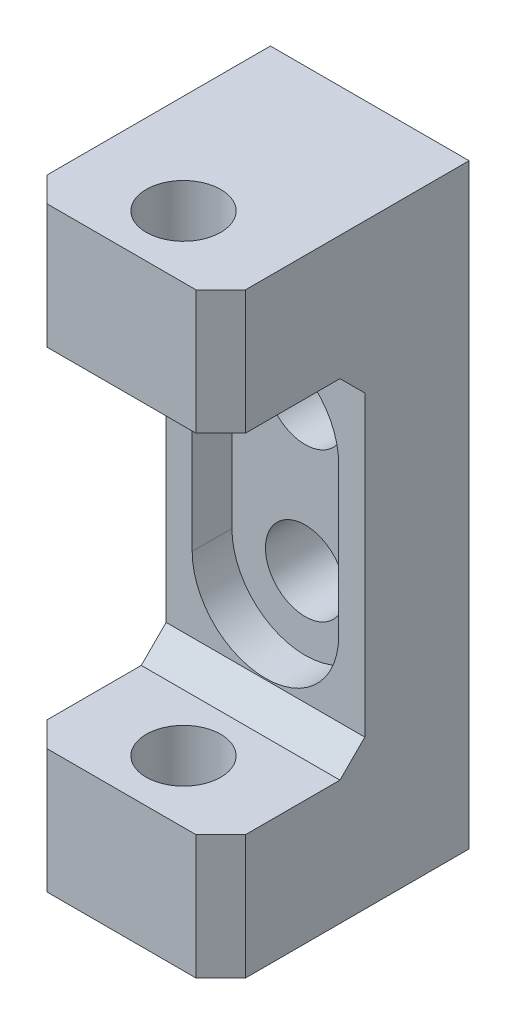
ISO-10303-21;
HEADER;
FILE_DESCRIPTION(('STEP AP214'),'2;1');
FILE_NAME('part.step','',(''),(''),'','','');
FILE_SCHEMA(('AUTOMOTIVE_DESIGN { 1 0 10303 214 1 1 1 1 }'));
ENDSEC;
DATA;
#1=APPLICATION_CONTEXT('core data for automotive mechanical design processes');
#2=APPLICATION_PROTOCOL_DEFINITION('international standard','automotive_design',2000,#1);
#3=PRODUCT_CONTEXT('',#1,'mechanical');
#4=PRODUCT('Part','Part','',(#3));
#5=PRODUCT_RELATED_PRODUCT_CATEGORY('part','',(#4));
#6=PRODUCT_DEFINITION_FORMATION('','',#4);
#7=PRODUCT_DEFINITION_CONTEXT('part definition',#1,'design');
#8=PRODUCT_DEFINITION('design','',#6,#7);
#9=PRODUCT_DEFINITION_SHAPE('','',#8);
#10=(LENGTH_UNIT() NAMED_UNIT(*) SI_UNIT(.MILLI.,.METRE.));
#11=(NAMED_UNIT(*) PLANE_ANGLE_UNIT() SI_UNIT($,.RADIAN.));
#12=(NAMED_UNIT(*) SI_UNIT($,.STERADIAN.) SOLID_ANGLE_UNIT());
#13=UNCERTAINTY_MEASURE_WITH_UNIT(LENGTH_MEASURE(1.E-05),#10,'distance_accuracy_value','');
#14=(GEOMETRIC_REPRESENTATION_CONTEXT(3) GLOBAL_UNCERTAINTY_ASSIGNED_CONTEXT((#13)) GLOBAL_UNIT_ASSIGNED_CONTEXT((#10,
#11,#12)) REPRESENTATION_CONTEXT('',''));
#15=CARTESIAN_POINT('',(0.,0.,0.));
#16=DIRECTION('',(0.,0.,1.));
#17=DIRECTION('',(1.,0.,0.));
#18=AXIS2_PLACEMENT_3D('',#15,#16,#17);
#19=CARTESIAN_POINT('',(104.,80.9999999999999,10.));
#20=DIRECTION('',(0.,1.,0.));
#21=DIRECTION('',(0.,0.,1.));
#22=AXIS2_PLACEMENT_3D('',#19,#20,#21);
#23=PLANE('',#22);
#24=DIRECTION('',(1.,0.,0.));
#25=VECTOR('',#24,1.);
#26=CARTESIAN_POINT('',(104.,80.9999999999999,10.));
#27=LINE('',#26,#25);
#28=CARTESIAN_POINT('',(97.,80.9999999999999,10.));
#29=VERTEX_POINT('',#28);
#30=CARTESIAN_POINT('',(103.,80.9999999999999,10.));
#31=VERTEX_POINT('',#30);
#32=EDGE_CURVE('E221',#29,#31,#27,.T.);
#33=ORIENTED_EDGE('',*,*,#32,.F.);
#34=DIRECTION('',(0.707106781186551,0.,0.707106781186544));
#35=VECTOR('',#34,1.);
#36=CARTESIAN_POINT('',(97.,80.9999999999999,9.99999999999998));
#37=LINE('',#36,#35);
#38=CARTESIAN_POINT('',(96.,80.9999999999999,9.));
#39=VERTEX_POINT('',#38);
#40=EDGE_CURVE('E282',#29,#39,#37,.F.);
#41=ORIENTED_EDGE('',*,*,#40,.T.);
#42=DIRECTION('',(0.,0.,-1.));
#43=VECTOR('',#42,1.);
#44=CARTESIAN_POINT('',(96.,80.9999999999999,10.));
#45=LINE('',#44,#43);
#46=CARTESIAN_POINT('',(96.,80.9999999999999,0.));
#47=VERTEX_POINT('',#46);
#48=EDGE_CURVE('E237',#39,#47,#45,.T.);
#49=ORIENTED_EDGE('',*,*,#48,.T.);
#50=DIRECTION('',(1.,0.,0.));
#51=VECTOR('',#50,1.);
#52=CARTESIAN_POINT('',(104.,80.9999999999999,0.));
#53=LINE('',#52,#51);
#54=CARTESIAN_POINT('',(104.,80.9999999999999,0.));
#55=VERTEX_POINT('',#54);
#56=EDGE_CURVE('E222',#47,#55,#53,.T.);
#57=ORIENTED_EDGE('',*,*,#56,.T.);
#58=DIRECTION('',(0.,0.,-1.));
#59=VECTOR('',#58,1.);
#60=CARTESIAN_POINT('',(104.,80.9999999999999,10.));
#61=LINE('',#60,#59);
#62=CARTESIAN_POINT('',(104.,80.9999999999999,9.));
#63=VERTEX_POINT('',#62);
#64=EDGE_CURVE('E225',#63,#55,#61,.T.);
#65=ORIENTED_EDGE('',*,*,#64,.F.);
#66=DIRECTION('',(0.707106781186551,0.,-0.707106781186544));
#67=VECTOR('',#66,1.);
#68=CARTESIAN_POINT('',(103.,80.9999999999999,9.99999999999998));
#69=LINE('',#68,#67);
#70=EDGE_CURVE('E280',#63,#31,#69,.F.);
#71=ORIENTED_EDGE('',*,*,#70,.T.);
#72=EDGE_LOOP('',(#33,#41,#49,#57,#65,#71));
#73=FACE_BOUND('',#72,.T.);
#74=CARTESIAN_POINT('',(100.,80.9999999999999,7.49999999999998));
#75=DIRECTION('',(0.,1.,0.));
#76=DIRECTION('',(0.,0.,1.));
#77=AXIS2_PLACEMENT_3D('',#74,#75,#76);
#78=CIRCLE('',#77,1.49999999999999);
#79=CARTESIAN_POINT('',(100.,80.9999999999999,8.99999999999997));
#80=VERTEX_POINT('',#79);
#81=EDGE_CURVE('E274',#80,#80,#78,.F.);
#82=ORIENTED_EDGE('',*,*,#81,.F.);
#83=EDGE_LOOP('',(#82));
#84=FACE_BOUND('',#83,.T.);
#85=ADVANCED_FACE('F37',(#73,#84),#23,.F.);
#86=CARTESIAN_POINT('',(100.,95.9999999999998,4.2));
#87=DIRECTION('',(0.,0.,1.));
#88=DIRECTION('',(1.,0.,0.));
#89=AXIS2_PLACEMENT_3D('',#86,#87,#88);
#90=CYLINDRICAL_SURFACE('',#89,2.94999999999999);
#91=DIRECTION('',(0.,0.,1.));
#92=VECTOR('',#91,1.);
#93=CARTESIAN_POINT('',(102.95,95.9999999999999,-10.6823190746194));
#94=LINE('',#93,#92);
#95=CARTESIAN_POINT('',(102.95,95.9999999999999,2.6));
#96=VERTEX_POINT('',#95);
#97=CARTESIAN_POINT('',(102.95,95.9999999999999,4.2));
#98=VERTEX_POINT('',#97);
#99=EDGE_CURVE('E164',#96,#98,#94,.T.);
#100=ORIENTED_EDGE('',*,*,#99,.T.);
#101=CARTESIAN_POINT('',(100.,95.9999999999998,4.2));
#102=DIRECTION('',(0.,0.,1.));
#103=DIRECTION('',(1.,0.,0.));
#104=AXIS2_PLACEMENT_3D('',#101,#102,#103);
#105=CIRCLE('',#104,2.94999999999999);
#106=CARTESIAN_POINT('',(97.0500000000001,95.9999999999999,4.2));
#107=VERTEX_POINT('',#106);
#108=EDGE_CURVE('E191',#98,#107,#105,.T.);
#109=ORIENTED_EDGE('',*,*,#108,.T.);
#110=DIRECTION('',(0.,0.,1.));
#111=VECTOR('',#110,1.);
#112=CARTESIAN_POINT('',(97.0500000000001,95.9999999999999,-10.6823190746194));
#113=LINE('',#112,#111);
#114=CARTESIAN_POINT('',(97.05,95.9999999999999,2.6));
#115=VERTEX_POINT('',#114);
#116=EDGE_CURVE('E175',#115,#107,#113,.T.);
#117=ORIENTED_EDGE('',*,*,#116,.F.);
#118=CARTESIAN_POINT('',(100.,95.9999999999998,2.6));
#119=DIRECTION('',(0.,0.,1.));
#120=DIRECTION('',(1.,0.,0.));
#121=AXIS2_PLACEMENT_3D('',#118,#119,#120);
#122=CIRCLE('',#121,2.94999999999999);
#123=EDGE_CURVE('E183',#96,#115,#122,.T.);
#124=ORIENTED_EDGE('',*,*,#123,.F.);
#125=EDGE_LOOP('',(#100,#109,#117,#124));
#126=FACE_BOUND('',#125,.T.);
#127=ADVANCED_FACE('F189',(#126),#90,.F.);
#128=CARTESIAN_POINT('',(0.,0.,10.));
#129=DIRECTION('',(0.,0.,-1.));
#130=DIRECTION('',(-1.,0.,0.));
#131=AXIS2_PLACEMENT_3D('',#128,#129,#130);
#132=PLANE('',#131);
#133=DIRECTION('',(-1.,0.,0.));
#134=VECTOR('',#133,1.);
#135=CARTESIAN_POINT('',(0.,85.9999999999999,10.));
#136=LINE('',#135,#134);
#137=CARTESIAN_POINT('',(103.,85.9999999999999,10.));
#138=VERTEX_POINT('',#137);
#139=CARTESIAN_POINT('',(97.,85.9999999999999,10.));
#140=VERTEX_POINT('',#139);
#141=EDGE_CURVE('E246',#138,#140,#136,.T.);
#142=ORIENTED_EDGE('',*,*,#141,.T.);
#143=DIRECTION('',(0.,-1.,0.));
#144=VECTOR('',#143,1.);
#145=CARTESIAN_POINT('',(96.9999999999999,0.,10.));
#146=LINE('',#145,#144);
#147=EDGE_CURVE('E277',#140,#29,#146,.T.);
#148=ORIENTED_EDGE('',*,*,#147,.T.);
#149=ORIENTED_EDGE('',*,*,#32,.T.);
#150=DIRECTION('',(0.,1.,0.));
#151=VECTOR('',#150,1.);
#152=CARTESIAN_POINT('',(103.,0.,10.));
#153=LINE('',#152,#151);
#154=EDGE_CURVE('E269',#31,#138,#153,.T.);
#155=ORIENTED_EDGE('',*,*,#154,.T.);
#156=EDGE_LOOP('',(#142,#148,#149,#155));
#157=FACE_BOUND('',#156,.T.);
#158=ADVANCED_FACE('F354',(#157),#132,.F.);
#159=CARTESIAN_POINT('',(104.,105.,10.));
#160=DIRECTION('',(-1.,0.,0.));
#161=DIRECTION('',(0.,-1.,0.));
#162=AXIS2_PLACEMENT_3D('',#159,#160,#161);
#163=PLANE('',#162);
#164=DIRECTION('',(0.,0.,1.));
#165=VECTOR('',#164,1.);
#166=CARTESIAN_POINT('',(104.,85.9999999999999,10.));
#167=LINE('',#166,#165);
#168=CARTESIAN_POINT('',(104.,85.9999999999999,5.20000000000001));
#169=VERTEX_POINT('',#168);
#170=CARTESIAN_POINT('',(104.,85.9999999999999,9.));
#171=VERTEX_POINT('',#170);
#172=EDGE_CURVE('E212',#169,#171,#167,.T.);
#173=ORIENTED_EDGE('',*,*,#172,.T.);
#174=DIRECTION('',(0.,-1.,0.));
#175=VECTOR('',#174,1.);
#176=CARTESIAN_POINT('',(104.,105.,9.));
#177=LINE('',#176,#175);
#178=EDGE_CURVE('E294',#171,#63,#177,.T.);
#179=ORIENTED_EDGE('',*,*,#178,.T.);
#180=ORIENTED_EDGE('',*,*,#64,.T.);
#181=DIRECTION('',(0.,1.,0.));
#182=VECTOR('',#181,1.);
#183=CARTESIAN_POINT('',(104.,105.,0.));
#184=LINE('',#183,#182);
#185=CARTESIAN_POINT('',(104.,105.,0.));
#186=VERTEX_POINT('',#185);
#187=EDGE_CURVE('E218',#55,#186,#184,.T.);
#188=ORIENTED_EDGE('',*,*,#187,.T.);
#189=DIRECTION('',(0.,0.,-1.));
#190=VECTOR('',#189,1.);
#191=CARTESIAN_POINT('',(104.,105.,10.));
#192=LINE('',#191,#190);
#193=CARTESIAN_POINT('',(104.,105.,9.));
#194=VERTEX_POINT('',#193);
#195=EDGE_CURVE('E241',#194,#186,#192,.T.);
#196=ORIENTED_EDGE('',*,*,#195,.F.);
#197=DIRECTION('',(0.,-1.,0.));
#198=VECTOR('',#197,1.);
#199=CARTESIAN_POINT('',(104.,105.,9.));
#200=LINE('',#199,#198);
#201=CARTESIAN_POINT('',(104.,99.9999999999999,9.));
#202=VERTEX_POINT('',#201);
#203=EDGE_CURVE('E292',#194,#202,#200,.T.);
#204=ORIENTED_EDGE('',*,*,#203,.T.);
#205=DIRECTION('',(0.,0.,-1.));
#206=VECTOR('',#205,1.);
#207=CARTESIAN_POINT('',(104.,99.9999999999999,10.));
#208=LINE('',#207,#206);
#209=CARTESIAN_POINT('',(104.,99.9999999999999,5.19999999999999));
#210=VERTEX_POINT('',#209);
#211=EDGE_CURVE('E210',#202,#210,#208,.T.);
#212=ORIENTED_EDGE('',*,*,#211,.T.);
#213=DIRECTION('',(0.,0.707106781186551,0.707106781186544));
#214=VECTOR('',#213,1.);
#215=CARTESIAN_POINT('',(104.,104.9,10.1));
#216=LINE('',#215,#214);
#217=CARTESIAN_POINT('',(104.,98.9999999999999,4.2));
#218=VERTEX_POINT('',#217);
#219=EDGE_CURVE('E267',#210,#218,#216,.F.);
#220=ORIENTED_EDGE('',*,*,#219,.T.);
#221=DIRECTION('',(0.,-1.,0.));
#222=VECTOR('',#221,1.);
#223=CARTESIAN_POINT('',(104.,105.,4.2));
#224=LINE('',#223,#222);
#225=CARTESIAN_POINT('',(104.,86.9999999999999,4.2));
#226=VERTEX_POINT('',#225);
#227=EDGE_CURVE('E215',#218,#226,#224,.T.);
#228=ORIENTED_EDGE('',*,*,#227,.T.);
#229=DIRECTION('',(0.,0.707106781186545,-0.70710678118655));
#230=VECTOR('',#229,1.);
#231=CARTESIAN_POINT('',(104.,93.0999999999998,-1.89999999999998));
#232=LINE('',#231,#230);
#233=EDGE_CURVE('E262',#226,#169,#232,.F.);
#234=ORIENTED_EDGE('',*,*,#233,.T.);
#235=EDGE_LOOP('',(#173,#179,#180,#188,#196,#204,#212,#220,#228,#234));
#236=FACE_BOUND('',#235,.T.);
#237=ADVANCED_FACE('F321',(#236),#163,.F.);
#238=CARTESIAN_POINT('',(104.,105.,10.));
#239=DIRECTION('',(0.,-1.,0.));
#240=DIRECTION('',(0.,0.,-1.));
#241=AXIS2_PLACEMENT_3D('',#238,#239,#240);
#242=PLANE('',#241);
#243=CARTESIAN_POINT('',(100.,105.,7.49999999999998));
#244=DIRECTION('',(0.,1.,0.));
#245=DIRECTION('',(0.,0.,1.));
#246=AXIS2_PLACEMENT_3D('',#243,#244,#245);
#247=CIRCLE('',#246,1.49999999999999);
#248=CARTESIAN_POINT('',(100.,105.,8.99999999999997));
#249=VERTEX_POINT('',#248);
#250=EDGE_CURVE('E490',#249,#249,#247,.T.);
#251=ORIENTED_EDGE('',*,*,#250,.F.);
#252=EDGE_LOOP('',(#251));
#253=FACE_BOUND('',#252,.T.);
#254=DIRECTION('',(-1.,0.,0.));
#255=VECTOR('',#254,1.);
#256=CARTESIAN_POINT('',(104.,105.,10.));
#257=LINE('',#256,#255);
#258=CARTESIAN_POINT('',(103.,105.,10.));
#259=VERTEX_POINT('',#258);
#260=CARTESIAN_POINT('',(97.,105.,10.));
#261=VERTEX_POINT('',#260);
#262=EDGE_CURVE('E219',#259,#261,#257,.T.);
#263=ORIENTED_EDGE('',*,*,#262,.F.);
#264=DIRECTION('',(-0.707106781186551,0.,0.707106781186544));
#265=VECTOR('',#264,1.);
#266=CARTESIAN_POINT('',(103.,105.,9.99999999999997));
#267=LINE('',#266,#265);
#268=EDGE_CURVE('E61',#259,#194,#267,.F.);
#269=ORIENTED_EDGE('',*,*,#268,.T.);
#270=ORIENTED_EDGE('',*,*,#195,.T.);
#271=DIRECTION('',(-1.,0.,0.));
#272=VECTOR('',#271,1.);
#273=CARTESIAN_POINT('',(104.,105.,0.));
#274=LINE('',#273,#272);
#275=CARTESIAN_POINT('',(96.,105.,0.));
#276=VERTEX_POINT('',#275);
#277=EDGE_CURVE('E228',#186,#276,#274,.T.);
#278=ORIENTED_EDGE('',*,*,#277,.T.);
#279=DIRECTION('',(0.,0.,-1.));
#280=VECTOR('',#279,1.);
#281=CARTESIAN_POINT('',(96.,105.,10.));
#282=LINE('',#281,#280);
#283=CARTESIAN_POINT('',(96.,105.,9.));
#284=VERTEX_POINT('',#283);
#285=EDGE_CURVE('E239',#284,#276,#282,.T.);
#286=ORIENTED_EDGE('',*,*,#285,.F.);
#287=DIRECTION('',(-0.707106781186551,0.,-0.707106781186544));
#288=VECTOR('',#287,1.);
#289=CARTESIAN_POINT('',(97.,105.,9.99999999999997));
#290=LINE('',#289,#288);
#291=EDGE_CURVE('E53',#284,#261,#290,.F.);
#292=ORIENTED_EDGE('',*,*,#291,.T.);
#293=EDGE_LOOP('',(#263,#269,#270,#278,#286,#292));
#294=FACE_BOUND('',#293,.T.);
#295=ADVANCED_FACE('F317',(#253,#294),#242,.F.);
#296=CARTESIAN_POINT('',(96.,105.,10.));
#297=DIRECTION('',(1.,0.,0.));
#298=DIRECTION('',(0.,1.,0.));
#299=AXIS2_PLACEMENT_3D('',#296,#297,#298);
#300=PLANE('',#299);
#301=ORIENTED_EDGE('',*,*,#48,.F.);
#302=DIRECTION('',(0.,1.,0.));
#303=VECTOR('',#302,1.);
#304=CARTESIAN_POINT('',(96.,105.,9.));
#305=LINE('',#304,#303);
#306=CARTESIAN_POINT('',(96.,85.9999999999999,9.));
#307=VERTEX_POINT('',#306);
#308=EDGE_CURVE('E286',#39,#307,#305,.T.);
#309=ORIENTED_EDGE('',*,*,#308,.T.);
#310=DIRECTION('',(0.,0.,1.));
#311=VECTOR('',#310,1.);
#312=CARTESIAN_POINT('',(96.,85.9999999999999,4.2));
#313=LINE('',#312,#311);
#314=CARTESIAN_POINT('',(96.,85.9999999999999,5.20000000000001));
#315=VERTEX_POINT('',#314);
#316=EDGE_CURVE('E207',#315,#307,#313,.T.);
#317=ORIENTED_EDGE('',*,*,#316,.F.);
#318=DIRECTION('',(0.,-0.707106781186545,0.70710678118655));
#319=VECTOR('',#318,1.);
#320=CARTESIAN_POINT('',(96.,93.0999999999998,-1.89999999999998));
#321=LINE('',#320,#319);
#322=CARTESIAN_POINT('',(96.,86.9999999999999,4.2));
#323=VERTEX_POINT('',#322);
#324=EDGE_CURVE('E260',#315,#323,#321,.F.);
#325=ORIENTED_EDGE('',*,*,#324,.T.);
#326=DIRECTION('',(0.,-1.,0.));
#327=VECTOR('',#326,1.);
#328=CARTESIAN_POINT('',(96.,99.9999999999999,4.2));
#329=LINE('',#328,#327);
#330=CARTESIAN_POINT('',(96.,98.9999999999999,4.2));
#331=VERTEX_POINT('',#330);
#332=EDGE_CURVE('E204',#331,#323,#329,.T.);
#333=ORIENTED_EDGE('',*,*,#332,.F.);
#334=DIRECTION('',(0.,-0.707106781186551,-0.707106781186544));
#335=VECTOR('',#334,1.);
#336=CARTESIAN_POINT('',(96.,104.9,10.1));
#337=LINE('',#336,#335);
#338=CARTESIAN_POINT('',(96.,99.9999999999999,5.19999999999999));
#339=VERTEX_POINT('',#338);
#340=EDGE_CURVE('E264',#331,#339,#337,.F.);
#341=ORIENTED_EDGE('',*,*,#340,.T.);
#342=DIRECTION('',(0.,0.,-1.));
#343=VECTOR('',#342,1.);
#344=CARTESIAN_POINT('',(96.,99.9999999999999,4.2));
#345=LINE('',#344,#343);
#346=CARTESIAN_POINT('',(96.,99.9999999999999,9.));
#347=VERTEX_POINT('',#346);
#348=EDGE_CURVE('E202',#347,#339,#345,.T.);
#349=ORIENTED_EDGE('',*,*,#348,.F.);
#350=DIRECTION('',(0.,1.,0.));
#351=VECTOR('',#350,1.);
#352=CARTESIAN_POINT('',(96.,105.,9.));
#353=LINE('',#352,#351);
#354=EDGE_CURVE('E284',#347,#284,#353,.T.);
#355=ORIENTED_EDGE('',*,*,#354,.T.);
#356=ORIENTED_EDGE('',*,*,#285,.T.);
#357=DIRECTION('',(0.,-1.,0.));
#358=VECTOR('',#357,1.);
#359=CARTESIAN_POINT('',(96.,105.,0.));
#360=LINE('',#359,#358);
#361=EDGE_CURVE('E231',#276,#47,#360,.T.);
#362=ORIENTED_EDGE('',*,*,#361,.T.);
#363=EDGE_LOOP('',(#301,#309,#317,#325,#333,#341,#349,#355,#356,#362));
#364=FACE_BOUND('',#363,.T.);
#365=ADVANCED_FACE('F312',(#364),#300,.F.);
#366=DIRECTION('',(1.,0.,0.));
#367=VECTOR('',#366,1.);
#368=CARTESIAN_POINT('',(0.,99.9999999999999,10.));
#369=LINE('',#368,#367);
#370=CARTESIAN_POINT('',(97.,99.9999999999999,10.));
#371=VERTEX_POINT('',#370);
#372=CARTESIAN_POINT('',(103.,99.9999999999999,10.));
#373=VERTEX_POINT('',#372);
#374=EDGE_CURVE('E243',#371,#373,#369,.T.);
#375=ORIENTED_EDGE('',*,*,#374,.T.);
#376=DIRECTION('',(0.,1.,0.));
#377=VECTOR('',#376,1.);
#378=CARTESIAN_POINT('',(103.,0.,10.));
#379=LINE('',#378,#377);
#380=EDGE_CURVE('E299',#373,#259,#379,.T.);
#381=ORIENTED_EDGE('',*,*,#380,.T.);
#382=ORIENTED_EDGE('',*,*,#262,.T.);
#383=DIRECTION('',(0.,-1.,0.));
#384=VECTOR('',#383,1.);
#385=CARTESIAN_POINT('',(96.9999999999999,0.,10.));
#386=LINE('',#385,#384);
#387=EDGE_CURVE('E296',#261,#371,#386,.T.);
#388=ORIENTED_EDGE('',*,*,#387,.T.);
#389=EDGE_LOOP('',(#375,#381,#382,#388));
#390=FACE_BOUND('',#389,.T.);
#391=ADVANCED_FACE('F316',(#390),#132,.F.);
#392=CARTESIAN_POINT('',(0.,0.,0.));
#393=DIRECTION('',(0.,0.,-1.));
#394=DIRECTION('',(-1.,0.,0.));
#395=AXIS2_PLACEMENT_3D('',#392,#393,#394);
#396=PLANE('',#395);
#397=CARTESIAN_POINT('',(100.,89.9999999999998,0.));
#398=DIRECTION('',(0.,0.,1.));
#399=DIRECTION('',(1.,0.,0.));
#400=AXIS2_PLACEMENT_3D('',#397,#398,#399);
#401=CIRCLE('',#400,1.6);
#402=CARTESIAN_POINT('',(101.6,89.9999999999998,0.));
#403=VERTEX_POINT('',#402);
#404=EDGE_CURVE('E196',#403,#403,#401,.T.);
#405=ORIENTED_EDGE('',*,*,#404,.T.);
#406=EDGE_LOOP('',(#405));
#407=FACE_BOUND('',#406,.T.);
#408=CARTESIAN_POINT('',(100.,95.9999999999998,0.));
#409=DIRECTION('',(0.,0.,1.));
#410=DIRECTION('',(1.,0.,0.));
#411=AXIS2_PLACEMENT_3D('',#408,#409,#410);
#412=CIRCLE('',#411,1.6);
#413=CARTESIAN_POINT('',(101.6,95.9999999999998,0.));
#414=VERTEX_POINT('',#413);
#415=EDGE_CURVE('E194',#414,#414,#412,.T.);
#416=ORIENTED_EDGE('',*,*,#415,.T.);
#417=EDGE_LOOP('',(#416));
#418=FACE_BOUND('',#417,.T.);
#419=ORIENTED_EDGE('',*,*,#187,.F.);
#420=ORIENTED_EDGE('',*,*,#56,.F.);
#421=ORIENTED_EDGE('',*,*,#361,.F.);
#422=ORIENTED_EDGE('',*,*,#277,.F.);
#423=EDGE_LOOP('',(#419,#420,#421,#422));
#424=FACE_BOUND('',#423,.T.);
#425=ADVANCED_FACE('F360',(#407,#418,#424),#396,.T.);
#426=CARTESIAN_POINT('',(136.,99.9999999999998,4.2));
#427=DIRECTION('',(0.,0.,-1.));
#428=DIRECTION('',(-1.,0.,0.));
#429=AXIS2_PLACEMENT_3D('',#426,#427,#428);
#430=PLANE('',#429);
#431=ORIENTED_EDGE('',*,*,#108,.F.);
#432=DIRECTION('',(0.,1.,0.));
#433=VECTOR('',#432,1.);
#434=CARTESIAN_POINT('',(102.95,89.9999999999998,4.2));
#435=LINE('',#434,#433);
#436=CARTESIAN_POINT('',(102.95,89.9999999999998,4.2));
#437=VERTEX_POINT('',#436);
#438=EDGE_CURVE('E170',#437,#98,#435,.T.);
#439=ORIENTED_EDGE('',*,*,#438,.F.);
#440=CARTESIAN_POINT('',(100.,89.9999999999998,4.2));
#441=DIRECTION('',(0.,0.,1.));
#442=DIRECTION('',(1.,0.,0.));
#443=AXIS2_PLACEMENT_3D('',#440,#441,#442);
#444=CIRCLE('',#443,2.94999999999999);
#445=CARTESIAN_POINT('',(97.0500000000001,89.9999999999998,4.2));
#446=VERTEX_POINT('',#445);
#447=EDGE_CURVE('E469',#446,#437,#444,.T.);
#448=ORIENTED_EDGE('',*,*,#447,.F.);
#449=DIRECTION('',(0.,-1.,0.));
#450=VECTOR('',#449,1.);
#451=CARTESIAN_POINT('',(97.0500000000001,89.9999999999998,4.2));
#452=LINE('',#451,#450);
#453=EDGE_CURVE('E186',#107,#446,#452,.T.);
#454=ORIENTED_EDGE('',*,*,#453,.F.);
#455=EDGE_LOOP('',(#431,#439,#448,#454));
#456=FACE_BOUND('',#455,.T.);
#457=ORIENTED_EDGE('',*,*,#332,.T.);
#458=DIRECTION('',(1.,0.,0.));
#459=VECTOR('',#458,1.);
#460=CARTESIAN_POINT('',(104.,86.9999999999999,4.2));
#461=LINE('',#460,#459);
#462=EDGE_CURVE('E255',#323,#226,#461,.T.);
#463=ORIENTED_EDGE('',*,*,#462,.T.);
#464=ORIENTED_EDGE('',*,*,#227,.F.);
#465=DIRECTION('',(-1.,0.,0.));
#466=VECTOR('',#465,1.);
#467=CARTESIAN_POINT('',(96.,98.9999999999999,4.2));
#468=LINE('',#467,#466);
#469=EDGE_CURVE('E252',#218,#331,#468,.T.);
#470=ORIENTED_EDGE('',*,*,#469,.T.);
#471=EDGE_LOOP('',(#457,#463,#464,#470));
#472=FACE_BOUND('',#471,.T.);
#473=ADVANCED_FACE('F331',(#456,#472),#430,.F.);
#474=CARTESIAN_POINT('',(136.,85.9999999999999,4.2));
#475=DIRECTION('',(0.,-1.,0.));
#476=DIRECTION('',(1.,0.,0.));
#477=AXIS2_PLACEMENT_3D('',#474,#475,#476);
#478=PLANE('',#477);
#479=CARTESIAN_POINT('',(100.,85.9999999999999,7.49999999999998));
#480=DIRECTION('',(0.,-1.,0.));
#481=DIRECTION('',(1.,0.,0.));
#482=AXIS2_PLACEMENT_3D('',#479,#480,#481);
#483=CIRCLE('',#482,1.49999999999999);
#484=CARTESIAN_POINT('',(101.5,85.9999999999999,7.49999999999998));
#485=VERTEX_POINT('',#484);
#486=EDGE_CURVE('E273',#485,#485,#483,.T.);
#487=ORIENTED_EDGE('',*,*,#486,.T.);
#488=EDGE_LOOP('',(#487));
#489=FACE_BOUND('',#488,.T.);
#490=ORIENTED_EDGE('',*,*,#316,.T.);
#491=DIRECTION('',(-0.707106781186551,0.,-0.707106781186544));
#492=VECTOR('',#491,1.);
#493=CARTESIAN_POINT('',(97.,85.9999999999999,10.));
#494=LINE('',#493,#492);
#495=EDGE_CURVE('E290',#307,#140,#494,.F.);
#496=ORIENTED_EDGE('',*,*,#495,.T.);
#497=ORIENTED_EDGE('',*,*,#141,.F.);
#498=DIRECTION('',(-0.707106781186551,0.,0.707106781186544));
#499=VECTOR('',#498,1.);
#500=CARTESIAN_POINT('',(103.,85.9999999999999,9.99999999999995));
#501=LINE('',#500,#499);
#502=EDGE_CURVE('E288',#138,#171,#501,.F.);
#503=ORIENTED_EDGE('',*,*,#502,.T.);
#504=ORIENTED_EDGE('',*,*,#172,.F.);
#505=DIRECTION('',(-1.,0.,0.));
#506=VECTOR('',#505,1.);
#507=CARTESIAN_POINT('',(96.,85.9999999999999,5.20000000000001));
#508=LINE('',#507,#506);
#509=EDGE_CURVE('E249',#169,#315,#508,.T.);
#510=ORIENTED_EDGE('',*,*,#509,.T.);
#511=EDGE_LOOP('',(#490,#496,#497,#503,#504,#510));
#512=FACE_BOUND('',#511,.T.);
#513=ADVANCED_FACE('F417',(#489,#512),#478,.F.);
#514=CARTESIAN_POINT('',(136.,99.9999999999998,4.2));
#515=DIRECTION('',(0.,1.,0.));
#516=DIRECTION('',(-1.,0.,0.));
#517=AXIS2_PLACEMENT_3D('',#514,#515,#516);
#518=PLANE('',#517);
#519=CARTESIAN_POINT('',(100.,99.9999999999999,7.49999999999998));
#520=DIRECTION('',(0.,1.,0.));
#521=DIRECTION('',(-1.,0.,0.));
#522=AXIS2_PLACEMENT_3D('',#519,#520,#521);
#523=CIRCLE('',#522,1.49999999999999);
#524=CARTESIAN_POINT('',(98.5,99.9999999999999,7.49999999999998));
#525=VERTEX_POINT('',#524);
#526=EDGE_CURVE('E270',#525,#525,#523,.T.);
#527=ORIENTED_EDGE('',*,*,#526,.T.);
#528=EDGE_LOOP('',(#527));
#529=FACE_BOUND('',#528,.T.);
#530=ORIENTED_EDGE('',*,*,#211,.F.);
#531=DIRECTION('',(0.707106781186551,0.,-0.707106781186544));
#532=VECTOR('',#531,1.);
#533=CARTESIAN_POINT('',(103.,99.9999999999999,9.99999999999994));
#534=LINE('',#533,#532);
#535=EDGE_CURVE('E11',#202,#373,#534,.F.);
#536=ORIENTED_EDGE('',*,*,#535,.T.);
#537=ORIENTED_EDGE('',*,*,#374,.F.);
#538=DIRECTION('',(0.707106781186551,0.,0.707106781186544));
#539=VECTOR('',#538,1.);
#540=CARTESIAN_POINT('',(97.,99.9999999999999,10.));
#541=LINE('',#540,#539);
#542=EDGE_CURVE('E46',#371,#347,#541,.F.);
#543=ORIENTED_EDGE('',*,*,#542,.T.);
#544=ORIENTED_EDGE('',*,*,#348,.T.);
#545=DIRECTION('',(1.,0.,0.));
#546=VECTOR('',#545,1.);
#547=CARTESIAN_POINT('',(104.,99.9999999999999,5.19999999999999));
#548=LINE('',#547,#546);
#549=EDGE_CURVE('E257',#339,#210,#548,.T.);
#550=ORIENTED_EDGE('',*,*,#549,.T.);
#551=EDGE_LOOP('',(#530,#536,#537,#543,#544,#550));
#552=FACE_BOUND('',#551,.T.);
#553=ADVANCED_FACE('F306',(#529,#552),#518,.F.);
#554=CARTESIAN_POINT('',(136.,85.9999999999999,5.20000000000001));
#555=DIRECTION('',(0.,0.70710678118655,0.707106781186545));
#556=DIRECTION('',(1.,0.,0.));
#557=AXIS2_PLACEMENT_3D('',#554,#555,#556);
#558=PLANE('',#557);
#559=ORIENTED_EDGE('',*,*,#233,.F.);
#560=ORIENTED_EDGE('',*,*,#462,.F.);
#561=ORIENTED_EDGE('',*,*,#324,.F.);
#562=ORIENTED_EDGE('',*,*,#509,.F.);
#563=EDGE_LOOP('',(#559,#560,#561,#562));
#564=FACE_BOUND('',#563,.T.);
#565=ADVANCED_FACE('F336',(#564),#558,.T.);
#566=CARTESIAN_POINT('',(136.,98.9999999999998,4.2));
#567=DIRECTION('',(0.,-0.707106781186544,0.707106781186551));
#568=DIRECTION('',(1.,0.,0.));
#569=AXIS2_PLACEMENT_3D('',#566,#567,#568);
#570=PLANE('',#569);
#571=ORIENTED_EDGE('',*,*,#219,.F.);
#572=ORIENTED_EDGE('',*,*,#549,.F.);
#573=ORIENTED_EDGE('',*,*,#340,.F.);
#574=ORIENTED_EDGE('',*,*,#469,.F.);
#575=EDGE_LOOP('',(#571,#572,#573,#574));
#576=FACE_BOUND('',#575,.T.);
#577=ADVANCED_FACE('F333',(#576),#570,.T.);
#578=CARTESIAN_POINT('',(100.,95.9999999999998,4.2));
#579=DIRECTION('',(0.,0.,1.));
#580=DIRECTION('',(1.,0.,0.));
#581=AXIS2_PLACEMENT_3D('',#578,#579,#580);
#582=CYLINDRICAL_SURFACE('',#581,1.6);
#583=ORIENTED_EDGE('',*,*,#415,.F.);
#584=EDGE_LOOP('',(#583));
#585=FACE_BOUND('',#584,.T.);
#586=CARTESIAN_POINT('',(100.,95.9999999999998,2.6));
#587=DIRECTION('',(0.,0.,1.));
#588=DIRECTION('',(1.,0.,0.));
#589=AXIS2_PLACEMENT_3D('',#586,#587,#588);
#590=CIRCLE('',#589,1.6);
#591=CARTESIAN_POINT('',(101.6,95.9999999999998,2.6));
#592=VERTEX_POINT('',#591);
#593=EDGE_CURVE('E190',#592,#592,#590,.T.);
#594=ORIENTED_EDGE('',*,*,#593,.T.);
#595=EDGE_LOOP('',(#594));
#596=FACE_BOUND('',#595,.T.);
#597=ADVANCED_FACE('F335',(#585,#596),#582,.F.);
#598=CARTESIAN_POINT('',(101.6,95.9999999999998,2.6));
#599=DIRECTION('',(0.,0.,-1.));
#600=DIRECTION('',(-1.,0.,0.));
#601=AXIS2_PLACEMENT_3D('',#598,#599,#600);
#602=PLANE('',#601);
#603=ORIENTED_EDGE('',*,*,#593,.F.);
#604=EDGE_LOOP('',(#603));
#605=FACE_BOUND('',#604,.T.);
#606=ORIENTED_EDGE('',*,*,#123,.T.);
#607=DIRECTION('',(0.,-1.,0.));
#608=VECTOR('',#607,1.);
#609=CARTESIAN_POINT('',(97.0500000000001,89.9999999999998,2.6));
#610=LINE('',#609,#608);
#611=CARTESIAN_POINT('',(97.0500000000001,89.9999999999998,2.6));
#612=VERTEX_POINT('',#611);
#613=EDGE_CURVE('E483',#115,#612,#610,.T.);
#614=ORIENTED_EDGE('',*,*,#613,.T.);
#615=CARTESIAN_POINT('',(100.,89.9999999999998,2.6));
#616=DIRECTION('',(0.,0.,1.));
#617=DIRECTION('',(1.,0.,0.));
#618=AXIS2_PLACEMENT_3D('',#615,#616,#617);
#619=CIRCLE('',#618,2.94999999999999);
#620=CARTESIAN_POINT('',(102.95,89.9999999999998,2.6));
#621=VERTEX_POINT('',#620);
#622=EDGE_CURVE('E185',#612,#621,#619,.T.);
#623=ORIENTED_EDGE('',*,*,#622,.T.);
#624=DIRECTION('',(0.,1.,0.));
#625=VECTOR('',#624,1.);
#626=CARTESIAN_POINT('',(102.95,89.9999999999998,2.6));
#627=LINE('',#626,#625);
#628=EDGE_CURVE('E167',#621,#96,#627,.T.);
#629=ORIENTED_EDGE('',*,*,#628,.T.);
#630=EDGE_LOOP('',(#606,#614,#623,#629));
#631=FACE_BOUND('',#630,.T.);
#632=CARTESIAN_POINT('',(100.,89.9999999999998,2.6));
#633=DIRECTION('',(0.,0.,1.));
#634=DIRECTION('',(1.,0.,0.));
#635=AXIS2_PLACEMENT_3D('',#632,#633,#634);
#636=CIRCLE('',#635,1.6);
#637=CARTESIAN_POINT('',(101.6,89.9999999999998,2.6));
#638=VERTEX_POINT('',#637);
#639=EDGE_CURVE('E474',#638,#638,#636,.T.);
#640=ORIENTED_EDGE('',*,*,#639,.F.);
#641=EDGE_LOOP('',(#640));
#642=FACE_BOUND('',#641,.T.);
#643=ADVANCED_FACE('F180',(#605,#631,#642),#602,.F.);
#644=CARTESIAN_POINT('',(100.,89.9999999999998,4.2));
#645=DIRECTION('',(0.,0.,1.));
#646=DIRECTION('',(1.,0.,0.));
#647=AXIS2_PLACEMENT_3D('',#644,#645,#646);
#648=CYLINDRICAL_SURFACE('',#647,1.6);
#649=ORIENTED_EDGE('',*,*,#404,.F.);
#650=EDGE_LOOP('',(#649));
#651=FACE_BOUND('',#650,.T.);
#652=ORIENTED_EDGE('',*,*,#639,.T.);
#653=EDGE_LOOP('',(#652));
#654=FACE_BOUND('',#653,.T.);
#655=ADVANCED_FACE('F428',(#651,#654),#648,.F.);
#656=CARTESIAN_POINT('',(100.,89.9999999999998,4.2));
#657=DIRECTION('',(0.,0.,1.));
#658=DIRECTION('',(1.,0.,0.));
#659=AXIS2_PLACEMENT_3D('',#656,#657,#658);
#660=CYLINDRICAL_SURFACE('',#659,2.94999999999999);
#661=ORIENTED_EDGE('',*,*,#447,.T.);
#662=DIRECTION('',(0.,0.,1.));
#663=VECTOR('',#662,1.);
#664=CARTESIAN_POINT('',(102.95,89.9999999999998,-10.6823190746194));
#665=LINE('',#664,#663);
#666=EDGE_CURVE('E470',#621,#437,#665,.T.);
#667=ORIENTED_EDGE('',*,*,#666,.F.);
#668=ORIENTED_EDGE('',*,*,#622,.F.);
#669=DIRECTION('',(0.,0.,1.));
#670=VECTOR('',#669,1.);
#671=CARTESIAN_POINT('',(97.0500000000001,89.9999999999998,-10.6823190746194));
#672=LINE('',#671,#670);
#673=EDGE_CURVE('E471',#612,#446,#672,.T.);
#674=ORIENTED_EDGE('',*,*,#673,.T.);
#675=EDGE_LOOP('',(#661,#667,#668,#674));
#676=FACE_BOUND('',#675,.T.);
#677=ADVANCED_FACE('F433',(#676),#660,.F.);
#678=CARTESIAN_POINT('',(102.95,89.9999999999998,-10.6823190746194));
#679=DIRECTION('',(1.,0.,0.));
#680=DIRECTION('',(0.,0.,-1.));
#681=AXIS2_PLACEMENT_3D('',#678,#679,#680);
#682=PLANE('',#681);
#683=ORIENTED_EDGE('',*,*,#666,.T.);
#684=ORIENTED_EDGE('',*,*,#438,.T.);
#685=ORIENTED_EDGE('',*,*,#99,.F.);
#686=ORIENTED_EDGE('',*,*,#628,.F.);
#687=EDGE_LOOP('',(#683,#684,#685,#686));
#688=FACE_BOUND('',#687,.T.);
#689=ADVANCED_FACE('F166',(#688),#682,.F.);
#690=CARTESIAN_POINT('',(97.0500000000001,89.9999999999998,-10.6823190746194));
#691=DIRECTION('',(-1.,0.,0.));
#692=DIRECTION('',(0.,0.,1.));
#693=AXIS2_PLACEMENT_3D('',#690,#691,#692);
#694=PLANE('',#693);
#695=ORIENTED_EDGE('',*,*,#116,.T.);
#696=ORIENTED_EDGE('',*,*,#453,.T.);
#697=ORIENTED_EDGE('',*,*,#673,.F.);
#698=ORIENTED_EDGE('',*,*,#613,.F.);
#699=EDGE_LOOP('',(#695,#696,#697,#698));
#700=FACE_BOUND('',#699,.T.);
#701=ADVANCED_FACE('F448',(#700),#694,.F.);
#702=CARTESIAN_POINT('',(100.,105.,7.49999999999998));
#703=DIRECTION('',(0.,1.,0.));
#704=DIRECTION('',(0.,0.,1.));
#705=AXIS2_PLACEMENT_3D('',#702,#703,#704);
#706=CYLINDRICAL_SURFACE('',#705,1.49999999999999);
#707=ORIENTED_EDGE('',*,*,#250,.T.);
#708=EDGE_LOOP('',(#707));
#709=FACE_BOUND('',#708,.T.);
#710=ORIENTED_EDGE('',*,*,#526,.F.);
#711=EDGE_LOOP('',(#710));
#712=FACE_BOUND('',#711,.T.);
#713=ADVANCED_FACE('F446',(#709,#712),#706,.F.);
#714=ORIENTED_EDGE('',*,*,#81,.T.);
#715=EDGE_LOOP('',(#714));
#716=FACE_BOUND('',#715,.T.);
#717=ORIENTED_EDGE('',*,*,#486,.F.);
#718=EDGE_LOOP('',(#717));
#719=FACE_BOUND('',#718,.T.);
#720=ADVANCED_FACE('F396',(#716,#719),#706,.F.);
#721=CARTESIAN_POINT('',(96.9999999999999,0.,10.));
#722=DIRECTION('',(0.707106781186544,0.,-0.70710678118655));
#723=DIRECTION('',(0.,-1.,0.));
#724=AXIS2_PLACEMENT_3D('',#721,#722,#723);
#725=PLANE('',#724);
#726=ORIENTED_EDGE('',*,*,#495,.F.);
#727=ORIENTED_EDGE('',*,*,#308,.F.);
#728=ORIENTED_EDGE('',*,*,#40,.F.);
#729=ORIENTED_EDGE('',*,*,#147,.F.);
#730=EDGE_LOOP('',(#726,#727,#728,#729));
#731=FACE_BOUND('',#730,.T.);
#732=ADVANCED_FACE('F377',(#731),#725,.F.);
#733=CARTESIAN_POINT('',(103.,0.,10.));
#734=DIRECTION('',(-0.707106781186544,0.,-0.70710678118655));
#735=DIRECTION('',(0.,1.,0.));
#736=AXIS2_PLACEMENT_3D('',#733,#734,#735);
#737=PLANE('',#736);
#738=ORIENTED_EDGE('',*,*,#70,.F.);
#739=ORIENTED_EDGE('',*,*,#178,.F.);
#740=ORIENTED_EDGE('',*,*,#502,.F.);
#741=ORIENTED_EDGE('',*,*,#154,.F.);
#742=EDGE_LOOP('',(#738,#739,#740,#741));
#743=FACE_BOUND('',#742,.T.);
#744=ADVANCED_FACE('F382',(#743),#737,.F.);
#745=CARTESIAN_POINT('',(103.,0.,10.));
#746=DIRECTION('',(-0.707106781186544,0.,-0.70710678118655));
#747=DIRECTION('',(0.,1.,0.));
#748=AXIS2_PLACEMENT_3D('',#745,#746,#747);
#749=PLANE('',#748);
#750=ORIENTED_EDGE('',*,*,#535,.F.);
#751=ORIENTED_EDGE('',*,*,#203,.F.);
#752=ORIENTED_EDGE('',*,*,#268,.F.);
#753=ORIENTED_EDGE('',*,*,#380,.F.);
#754=EDGE_LOOP('',(#750,#751,#752,#753));
#755=FACE_BOUND('',#754,.T.);
#756=ADVANCED_FACE('F324',(#755),#749,.F.);
#757=CARTESIAN_POINT('',(96.9999999999999,0.,10.));
#758=DIRECTION('',(0.707106781186544,0.,-0.70710678118655));
#759=DIRECTION('',(0.,-1.,0.));
#760=AXIS2_PLACEMENT_3D('',#757,#758,#759);
#761=PLANE('',#760);
#762=ORIENTED_EDGE('',*,*,#291,.F.);
#763=ORIENTED_EDGE('',*,*,#354,.F.);
#764=ORIENTED_EDGE('',*,*,#542,.F.);
#765=ORIENTED_EDGE('',*,*,#387,.F.);
#766=EDGE_LOOP('',(#762,#763,#764,#765));
#767=FACE_BOUND('',#766,.T.);
#768=ADVANCED_FACE('F40',(#767),#761,.F.);
#769=CLOSED_SHELL('',(#85,#127,#158,#237,#295,#365,#391,#425,#473,#513,#553,#565,#577,#597,#643,
#655,#677,#689,#701,#713,#720,#732,#744,#756,#768));
#770=MANIFOLD_SOLID_BREP('B2',#769);
#771=ADVANCED_BREP_SHAPE_REPRESENTATION('',(#18,#770),#14);
#772=SHAPE_DEFINITION_REPRESENTATION(#9,#771);
ENDSEC;
END-ISO-10303-21;
